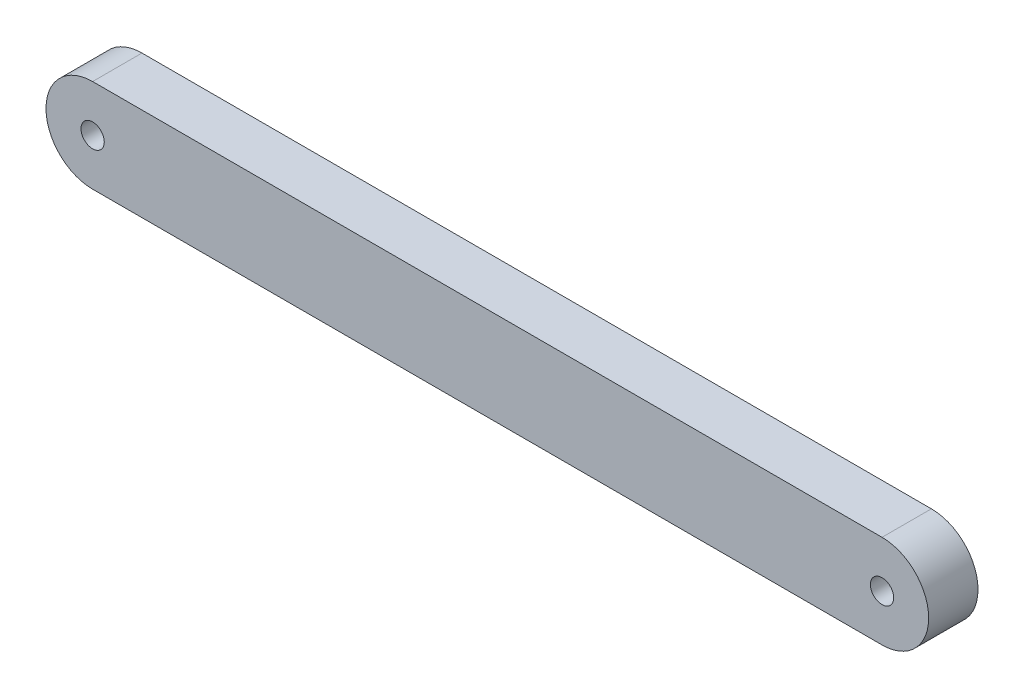
ISO-10303-21;
HEADER;
FILE_DESCRIPTION(('STEP AP214'),'2;1');
FILE_NAME('part.step','',(''),(''),'','','');
FILE_SCHEMA(('AUTOMOTIVE_DESIGN { 1 0 10303 214 1 1 1 1 }'));
ENDSEC;
DATA;
#1=APPLICATION_CONTEXT('core data for automotive mechanical design processes');
#2=APPLICATION_PROTOCOL_DEFINITION('international standard','automotive_design',2000,#1);
#3=PRODUCT_CONTEXT('',#1,'mechanical');
#4=PRODUCT('Part','Part','',(#3));
#5=PRODUCT_RELATED_PRODUCT_CATEGORY('part','',(#4));
#6=PRODUCT_DEFINITION_FORMATION('','',#4);
#7=PRODUCT_DEFINITION_CONTEXT('part definition',#1,'design');
#8=PRODUCT_DEFINITION('design','',#6,#7);
#9=PRODUCT_DEFINITION_SHAPE('','',#8);
#10=(LENGTH_UNIT() NAMED_UNIT(*) SI_UNIT(.MILLI.,.METRE.));
#11=(NAMED_UNIT(*) PLANE_ANGLE_UNIT() SI_UNIT($,.RADIAN.));
#12=(NAMED_UNIT(*) SI_UNIT($,.STERADIAN.) SOLID_ANGLE_UNIT());
#13=UNCERTAINTY_MEASURE_WITH_UNIT(LENGTH_MEASURE(1.E-05),#10,'distance_accuracy_value','');
#14=(GEOMETRIC_REPRESENTATION_CONTEXT(3) GLOBAL_UNCERTAINTY_ASSIGNED_CONTEXT((#13)) GLOBAL_UNIT_ASSIGNED_CONTEXT((#10,
#11,#12)) REPRESENTATION_CONTEXT('',''));
#15=CARTESIAN_POINT('',(0.,0.,0.));
#16=DIRECTION('',(0.,0.,1.));
#17=DIRECTION('',(1.,0.,0.));
#18=AXIS2_PLACEMENT_3D('',#15,#16,#17);
#19=CARTESIAN_POINT('',(0.,0.,6.35));
#20=DIRECTION('',(0.,0.,-1.));
#21=DIRECTION('',(-1.,0.,0.));
#22=AXIS2_PLACEMENT_3D('',#19,#20,#21);
#23=CYLINDRICAL_SURFACE('',#22,6.);
#24=CARTESIAN_POINT('',(0.,0.,0.));
#25=DIRECTION('',(0.,0.,1.));
#26=DIRECTION('',(1.,0.,0.));
#27=AXIS2_PLACEMENT_3D('',#24,#25,#26);
#28=CIRCLE('',#27,6.);
#29=CARTESIAN_POINT('',(0.,6.,0.));
#30=VERTEX_POINT('',#29);
#31=CARTESIAN_POINT('',(0.,-6.,0.));
#32=VERTEX_POINT('',#31);
#33=EDGE_CURVE('E107',#30,#32,#28,.T.);
#34=ORIENTED_EDGE('',*,*,#33,.T.);
#35=DIRECTION('',(0.,0.,-1.));
#36=VECTOR('',#35,1.);
#37=CARTESIAN_POINT('',(0.,-6.,6.35));
#38=LINE('',#37,#36);
#39=CARTESIAN_POINT('',(0.,-6.,6.35));
#40=VERTEX_POINT('',#39);
#41=EDGE_CURVE('E11',#40,#32,#38,.T.);
#42=ORIENTED_EDGE('',*,*,#41,.F.);
#43=CARTESIAN_POINT('',(0.,0.,6.35));
#44=DIRECTION('',(0.,0.,1.));
#45=DIRECTION('',(1.,0.,0.));
#46=AXIS2_PLACEMENT_3D('',#43,#44,#45);
#47=CIRCLE('',#46,6.);
#48=CARTESIAN_POINT('',(0.,6.,6.35));
#49=VERTEX_POINT('',#48);
#50=EDGE_CURVE('E91',#49,#40,#47,.T.);
#51=ORIENTED_EDGE('',*,*,#50,.F.);
#52=DIRECTION('',(0.,0.,-1.));
#53=VECTOR('',#52,1.);
#54=CARTESIAN_POINT('',(0.,6.,6.35));
#55=LINE('',#54,#53);
#56=EDGE_CURVE('E103',#49,#30,#55,.T.);
#57=ORIENTED_EDGE('',*,*,#56,.T.);
#58=EDGE_LOOP('',(#34,#42,#51,#57));
#59=FACE_BOUND('',#58,.T.);
#60=ADVANCED_FACE('F39',(#59),#23,.T.);
#61=CARTESIAN_POINT('',(0.,-6.,6.35));
#62=DIRECTION('',(0.,1.,0.));
#63=DIRECTION('',(0.,0.,1.));
#64=AXIS2_PLACEMENT_3D('',#61,#62,#63);
#65=PLANE('',#64);
#66=DIRECTION('',(1.,0.,0.));
#67=VECTOR('',#66,1.);
#68=CARTESIAN_POINT('',(0.,-6.,0.));
#69=LINE('',#68,#67);
#70=CARTESIAN_POINT('',(101.6,-6.,0.));
#71=VERTEX_POINT('',#70);
#72=EDGE_CURVE('E96',#32,#71,#69,.T.);
#73=ORIENTED_EDGE('',*,*,#72,.T.);
#74=DIRECTION('',(0.,0.,-1.));
#75=VECTOR('',#74,1.);
#76=CARTESIAN_POINT('',(101.6,-6.,6.35));
#77=LINE('',#76,#75);
#78=CARTESIAN_POINT('',(101.6,-6.,6.35));
#79=VERTEX_POINT('',#78);
#80=EDGE_CURVE('E48',#79,#71,#77,.T.);
#81=ORIENTED_EDGE('',*,*,#80,.F.);
#82=DIRECTION('',(1.,0.,0.));
#83=VECTOR('',#82,1.);
#84=CARTESIAN_POINT('',(0.,-6.,6.35));
#85=LINE('',#84,#83);
#86=EDGE_CURVE('E86',#40,#79,#85,.T.);
#87=ORIENTED_EDGE('',*,*,#86,.F.);
#88=ORIENTED_EDGE('',*,*,#41,.T.);
#89=EDGE_LOOP('',(#73,#81,#87,#88));
#90=FACE_BOUND('',#89,.T.);
#91=ADVANCED_FACE('F95',(#90),#65,.F.);
#92=CARTESIAN_POINT('',(101.6,0.,6.35));
#93=DIRECTION('',(0.,0.,-1.));
#94=DIRECTION('',(-1.,0.,0.));
#95=AXIS2_PLACEMENT_3D('',#92,#93,#94);
#96=CYLINDRICAL_SURFACE('',#95,6.);
#97=CARTESIAN_POINT('',(101.6,0.,0.));
#98=DIRECTION('',(0.,0.,1.));
#99=DIRECTION('',(1.,0.,0.));
#100=AXIS2_PLACEMENT_3D('',#97,#98,#99);
#101=CIRCLE('',#100,6.);
#102=CARTESIAN_POINT('',(101.6,6.,0.));
#103=VERTEX_POINT('',#102);
#104=EDGE_CURVE('E73',#71,#103,#101,.T.);
#105=ORIENTED_EDGE('',*,*,#104,.T.);
#106=DIRECTION('',(0.,0.,-1.));
#107=VECTOR('',#106,1.);
#108=CARTESIAN_POINT('',(101.6,6.,6.35));
#109=LINE('',#108,#107);
#110=CARTESIAN_POINT('',(101.6,6.,6.35));
#111=VERTEX_POINT('',#110);
#112=EDGE_CURVE('E98',#111,#103,#109,.T.);
#113=ORIENTED_EDGE('',*,*,#112,.F.);
#114=CARTESIAN_POINT('',(101.6,0.,6.35));
#115=DIRECTION('',(0.,0.,1.));
#116=DIRECTION('',(1.,0.,0.));
#117=AXIS2_PLACEMENT_3D('',#114,#115,#116);
#118=CIRCLE('',#117,6.);
#119=EDGE_CURVE('E89',#79,#111,#118,.T.);
#120=ORIENTED_EDGE('',*,*,#119,.F.);
#121=ORIENTED_EDGE('',*,*,#80,.T.);
#122=EDGE_LOOP('',(#105,#113,#120,#121));
#123=FACE_BOUND('',#122,.T.);
#124=ADVANCED_FACE('F99',(#123),#96,.T.);
#125=CARTESIAN_POINT('',(0.,6.,6.35));
#126=DIRECTION('',(0.,-1.,0.));
#127=DIRECTION('',(0.,0.,-1.));
#128=AXIS2_PLACEMENT_3D('',#125,#126,#127);
#129=PLANE('',#128);
#130=DIRECTION('',(-1.,0.,0.));
#131=VECTOR('',#130,1.);
#132=CARTESIAN_POINT('',(0.,6.,0.));
#133=LINE('',#132,#131);
#134=EDGE_CURVE('E79',#103,#30,#133,.T.);
#135=ORIENTED_EDGE('',*,*,#134,.T.);
#136=ORIENTED_EDGE('',*,*,#56,.F.);
#137=DIRECTION('',(-1.,0.,0.));
#138=VECTOR('',#137,1.);
#139=CARTESIAN_POINT('',(0.,6.,6.35));
#140=LINE('',#139,#138);
#141=EDGE_CURVE('E56',#111,#49,#140,.T.);
#142=ORIENTED_EDGE('',*,*,#141,.F.);
#143=ORIENTED_EDGE('',*,*,#112,.T.);
#144=EDGE_LOOP('',(#135,#136,#142,#143));
#145=FACE_BOUND('',#144,.T.);
#146=ADVANCED_FACE('F121',(#145),#129,.F.);
#147=CARTESIAN_POINT('',(0.,0.,6.35));
#148=DIRECTION('',(0.,0.,1.));
#149=DIRECTION('',(1.,0.,0.));
#150=AXIS2_PLACEMENT_3D('',#147,#148,#149);
#151=PLANE('',#150);
#152=CARTESIAN_POINT('',(101.6,0.,6.35));
#153=DIRECTION('',(0.,0.,1.));
#154=DIRECTION('',(1.,0.,0.));
#155=AXIS2_PLACEMENT_3D('',#152,#153,#154);
#156=CIRCLE('',#155,1.5);
#157=CARTESIAN_POINT('',(103.1,0.,6.35));
#158=VERTEX_POINT('',#157);
#159=EDGE_CURVE('E136',#158,#158,#156,.T.);
#160=ORIENTED_EDGE('',*,*,#159,.F.);
#161=EDGE_LOOP('',(#160));
#162=FACE_BOUND('',#161,.T.);
#163=CARTESIAN_POINT('',(0.,0.,6.35));
#164=DIRECTION('',(0.,0.,1.));
#165=DIRECTION('',(1.,0.,0.));
#166=AXIS2_PLACEMENT_3D('',#163,#164,#165);
#167=CIRCLE('',#166,1.5);
#168=CARTESIAN_POINT('',(1.5,0.,6.35));
#169=VERTEX_POINT('',#168);
#170=EDGE_CURVE('E128',#169,#169,#167,.T.);
#171=ORIENTED_EDGE('',*,*,#170,.F.);
#172=EDGE_LOOP('',(#171));
#173=FACE_BOUND('',#172,.T.);
#174=ORIENTED_EDGE('',*,*,#50,.T.);
#175=ORIENTED_EDGE('',*,*,#86,.T.);
#176=ORIENTED_EDGE('',*,*,#119,.T.);
#177=ORIENTED_EDGE('',*,*,#141,.T.);
#178=EDGE_LOOP('',(#174,#175,#176,#177));
#179=FACE_BOUND('',#178,.T.);
#180=ADVANCED_FACE('F87',(#162,#173,#179),#151,.T.);
#181=CARTESIAN_POINT('',(0.,0.,0.));
#182=DIRECTION('',(0.,0.,1.));
#183=DIRECTION('',(1.,0.,0.));
#184=AXIS2_PLACEMENT_3D('',#181,#182,#183);
#185=PLANE('',#184);
#186=CARTESIAN_POINT('',(101.6,0.,0.));
#187=DIRECTION('',(0.,0.,1.));
#188=DIRECTION('',(1.,0.,0.));
#189=AXIS2_PLACEMENT_3D('',#186,#187,#188);
#190=CIRCLE('',#189,1.5);
#191=CARTESIAN_POINT('',(103.1,0.,0.));
#192=VERTEX_POINT('',#191);
#193=EDGE_CURVE('E132',#192,#192,#190,.T.);
#194=ORIENTED_EDGE('',*,*,#193,.T.);
#195=EDGE_LOOP('',(#194));
#196=FACE_BOUND('',#195,.T.);
#197=CARTESIAN_POINT('',(0.,0.,0.));
#198=DIRECTION('',(0.,0.,1.));
#199=DIRECTION('',(1.,0.,0.));
#200=AXIS2_PLACEMENT_3D('',#197,#198,#199);
#201=CIRCLE('',#200,1.5);
#202=CARTESIAN_POINT('',(1.5,0.,0.));
#203=VERTEX_POINT('',#202);
#204=EDGE_CURVE('E111',#203,#203,#201,.T.);
#205=ORIENTED_EDGE('',*,*,#204,.T.);
#206=EDGE_LOOP('',(#205));
#207=FACE_BOUND('',#206,.T.);
#208=ORIENTED_EDGE('',*,*,#33,.F.);
#209=ORIENTED_EDGE('',*,*,#134,.F.);
#210=ORIENTED_EDGE('',*,*,#104,.F.);
#211=ORIENTED_EDGE('',*,*,#72,.F.);
#212=EDGE_LOOP('',(#208,#209,#210,#211));
#213=FACE_BOUND('',#212,.T.);
#214=ADVANCED_FACE('F124',(#196,#207,#213),#185,.F.);
#215=CARTESIAN_POINT('',(0.,0.,0.));
#216=DIRECTION('',(0.,0.,1.));
#217=DIRECTION('',(1.,0.,0.));
#218=AXIS2_PLACEMENT_3D('',#215,#216,#217);
#219=CYLINDRICAL_SURFACE('',#218,1.5);
#220=ORIENTED_EDGE('',*,*,#204,.F.);
#221=EDGE_LOOP('',(#220));
#222=FACE_BOUND('',#221,.T.);
#223=ORIENTED_EDGE('',*,*,#170,.T.);
#224=EDGE_LOOP('',(#223));
#225=FACE_BOUND('',#224,.T.);
#226=ADVANCED_FACE('F149',(#222,#225),#219,.F.);
#227=CARTESIAN_POINT('',(101.6,0.,0.));
#228=DIRECTION('',(0.,0.,1.));
#229=DIRECTION('',(1.,0.,0.));
#230=AXIS2_PLACEMENT_3D('',#227,#228,#229);
#231=CYLINDRICAL_SURFACE('',#230,1.5);
#232=ORIENTED_EDGE('',*,*,#193,.F.);
#233=EDGE_LOOP('',(#232));
#234=FACE_BOUND('',#233,.T.);
#235=ORIENTED_EDGE('',*,*,#159,.T.);
#236=EDGE_LOOP('',(#235));
#237=FACE_BOUND('',#236,.T.);
#238=ADVANCED_FACE('F146',(#234,#237),#231,.F.);
#239=CLOSED_SHELL('',(#60,#91,#124,#146,#180,#214,#226,#238));
#240=MANIFOLD_SOLID_BREP('B2',#239);
#241=ADVANCED_BREP_SHAPE_REPRESENTATION('',(#18,#240),#14);
#242=SHAPE_DEFINITION_REPRESENTATION(#9,#241);
ENDSEC;
END-ISO-10303-21;
